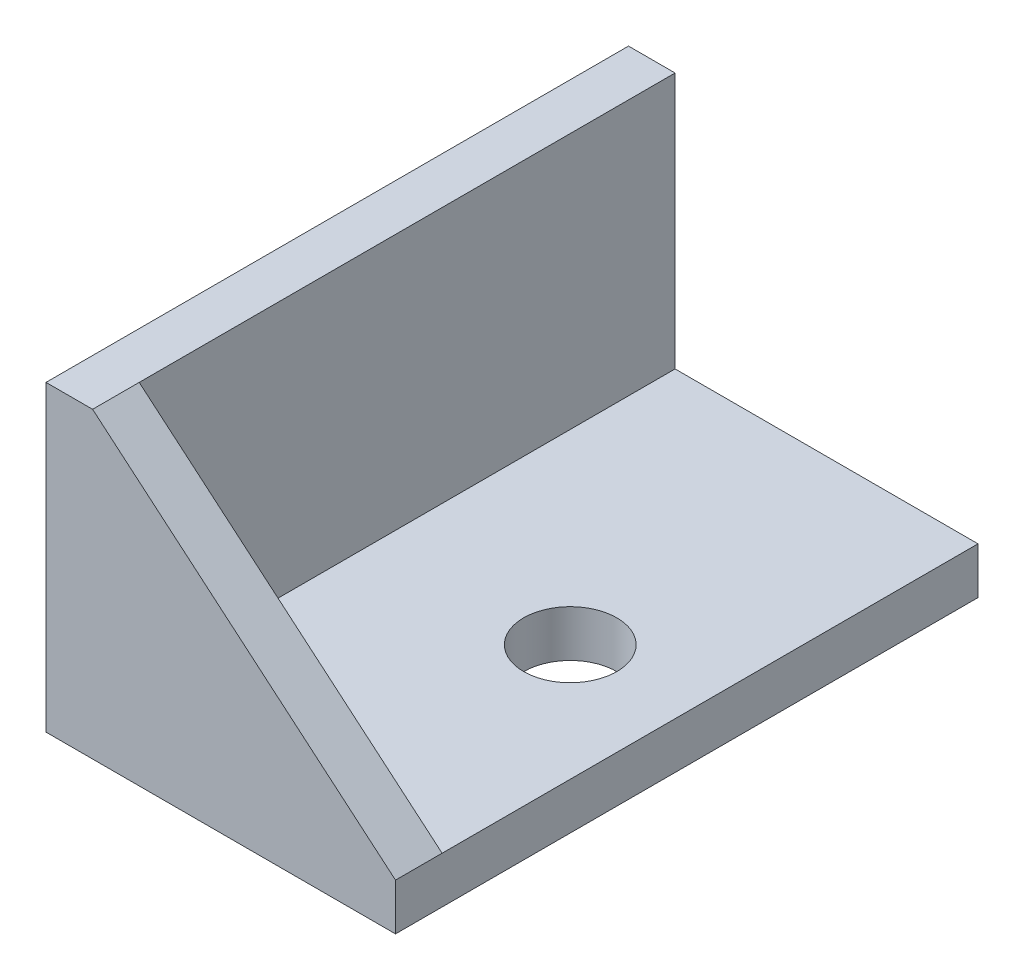
ISO-10303-21;
HEADER;
FILE_DESCRIPTION(('STEP AP214'),'2;1');
FILE_NAME('part.step','',(''),(''),'','','');
FILE_SCHEMA(('AUTOMOTIVE_DESIGN { 1 0 10303 214 1 1 1 1 }'));
ENDSEC;
DATA;
#1=APPLICATION_CONTEXT('core data for automotive mechanical design processes');
#2=APPLICATION_PROTOCOL_DEFINITION('international standard','automotive_design',2000,#1);
#3=PRODUCT_CONTEXT('',#1,'mechanical');
#4=PRODUCT('Part','Part','',(#3));
#5=PRODUCT_RELATED_PRODUCT_CATEGORY('part','',(#4));
#6=PRODUCT_DEFINITION_FORMATION('','',#4);
#7=PRODUCT_DEFINITION_CONTEXT('part definition',#1,'design');
#8=PRODUCT_DEFINITION('design','',#6,#7);
#9=PRODUCT_DEFINITION_SHAPE('','',#8);
#10=(LENGTH_UNIT() NAMED_UNIT(*) SI_UNIT(.MILLI.,.METRE.));
#11=(NAMED_UNIT(*) PLANE_ANGLE_UNIT() SI_UNIT($,.RADIAN.));
#12=(NAMED_UNIT(*) SI_UNIT($,.STERADIAN.) SOLID_ANGLE_UNIT());
#13=UNCERTAINTY_MEASURE_WITH_UNIT(LENGTH_MEASURE(1.E-05),#10,'distance_accuracy_value','');
#14=(GEOMETRIC_REPRESENTATION_CONTEXT(3) GLOBAL_UNCERTAINTY_ASSIGNED_CONTEXT((#13)) GLOBAL_UNIT_ASSIGNED_CONTEXT((#10,
#11,#12)) REPRESENTATION_CONTEXT('',''));
#15=CARTESIAN_POINT('',(0.,0.,0.));
#16=DIRECTION('',(0.,0.,1.));
#17=DIRECTION('',(1.,0.,0.));
#18=AXIS2_PLACEMENT_3D('',#15,#16,#17);
#19=CARTESIAN_POINT('',(9.99999999999999,65.,-125.));
#20=DIRECTION('',(1.,0.,0.));
#21=DIRECTION('',(0.,1.,0.));
#22=AXIS2_PLACEMENT_3D('',#19,#20,#21);
#23=PLANE('',#22);
#24=DIRECTION('',(0.,0.,1.));
#25=VECTOR('',#24,1.);
#26=CARTESIAN_POINT('',(9.99999999999999,65.,-125.));
#27=LINE('',#26,#25);
#28=CARTESIAN_POINT('',(9.99999999999999,65.,-125.));
#29=VERTEX_POINT('',#28);
#30=CARTESIAN_POINT('',(9.99999999999999,65.,-10.));
#31=VERTEX_POINT('',#30);
#32=EDGE_CURVE('E99',#29,#31,#27,.T.);
#33=ORIENTED_EDGE('',*,*,#32,.T.);
#34=DIRECTION('',(0.,-1.,0.));
#35=VECTOR('',#34,1.);
#36=CARTESIAN_POINT('',(10.,10.,-10.));
#37=LINE('',#36,#35);
#38=CARTESIAN_POINT('',(10.,10.,-10.));
#39=VERTEX_POINT('',#38);
#40=EDGE_CURVE('E217',#31,#39,#37,.T.);
#41=ORIENTED_EDGE('',*,*,#40,.T.);
#42=DIRECTION('',(0.,0.,1.));
#43=VECTOR('',#42,1.);
#44=CARTESIAN_POINT('',(10.,10.,-125.));
#45=LINE('',#44,#43);
#46=CARTESIAN_POINT('',(10.,10.,-125.));
#47=VERTEX_POINT('',#46);
#48=EDGE_CURVE('E110',#47,#39,#45,.T.);
#49=ORIENTED_EDGE('',*,*,#48,.F.);
#50=DIRECTION('',(0.,1.,0.));
#51=VECTOR('',#50,1.);
#52=CARTESIAN_POINT('',(9.99999999999999,65.,-125.));
#53=LINE('',#52,#51);
#54=EDGE_CURVE('E116',#47,#29,#53,.T.);
#55=ORIENTED_EDGE('',*,*,#54,.T.);
#56=EDGE_LOOP('',(#33,#41,#49,#55));
#57=FACE_BOUND('',#56,.T.);
#58=ADVANCED_FACE('F43',(#57),#23,.T.);
#59=CARTESIAN_POINT('',(10.,10.,-125.));
#60=DIRECTION('',(0.,1.,0.));
#61=DIRECTION('',(-1.,0.,0.));
#62=AXIS2_PLACEMENT_3D('',#59,#60,#61);
#63=PLANE('',#62);
#64=CARTESIAN_POINT('',(50.,10.,-62.5));
#65=DIRECTION('',(0.,1.,0.));
#66=DIRECTION('',(-1.,0.,0.));
#67=AXIS2_PLACEMENT_3D('',#64,#65,#66);
#68=CIRCLE('',#67,10.);
#69=CARTESIAN_POINT('',(40.,10.,-62.5));
#70=VERTEX_POINT('',#69);
#71=EDGE_CURVE('E210',#70,#70,#68,.T.);
#72=ORIENTED_EDGE('',*,*,#71,.F.);
#73=EDGE_LOOP('',(#72));
#74=FACE_BOUND('',#73,.T.);
#75=ORIENTED_EDGE('',*,*,#48,.T.);
#76=DIRECTION('',(1.,0.,0.));
#77=VECTOR('',#76,1.);
#78=CARTESIAN_POINT('',(75.,10.,-10.));
#79=LINE('',#78,#77);
#80=CARTESIAN_POINT('',(75.,10.,-10.));
#81=VERTEX_POINT('',#80);
#82=EDGE_CURVE('E220',#39,#81,#79,.T.);
#83=ORIENTED_EDGE('',*,*,#82,.T.);
#84=DIRECTION('',(0.,0.,1.));
#85=VECTOR('',#84,1.);
#86=CARTESIAN_POINT('',(75.,10.,-125.));
#87=LINE('',#86,#85);
#88=CARTESIAN_POINT('',(75.,10.,-125.));
#89=VERTEX_POINT('',#88);
#90=EDGE_CURVE('E151',#89,#81,#87,.T.);
#91=ORIENTED_EDGE('',*,*,#90,.F.);
#92=DIRECTION('',(-1.,0.,0.));
#93=VECTOR('',#92,1.);
#94=CARTESIAN_POINT('',(10.,10.,-125.));
#95=LINE('',#94,#93);
#96=EDGE_CURVE('E123',#89,#47,#95,.T.);
#97=ORIENTED_EDGE('',*,*,#96,.T.);
#98=EDGE_LOOP('',(#75,#83,#91,#97));
#99=FACE_BOUND('',#98,.T.);
#100=ADVANCED_FACE('F172',(#74,#99),#63,.T.);
#101=CARTESIAN_POINT('',(75.,0.,-125.));
#102=DIRECTION('',(0.,-1.,0.));
#103=DIRECTION('',(1.,0.,0.));
#104=AXIS2_PLACEMENT_3D('',#101,#102,#103);
#105=PLANE('',#104);
#106=CARTESIAN_POINT('',(50.,0.,-62.5));
#107=DIRECTION('',(0.,1.,0.));
#108=DIRECTION('',(-1.,0.,0.));
#109=AXIS2_PLACEMENT_3D('',#106,#107,#108);
#110=CIRCLE('',#109,10.);
#111=CARTESIAN_POINT('',(40.,0.,-62.5));
#112=VERTEX_POINT('',#111);
#113=EDGE_CURVE('E207',#112,#112,#110,.T.);
#114=ORIENTED_EDGE('',*,*,#113,.T.);
#115=EDGE_LOOP('',(#114));
#116=FACE_BOUND('',#115,.T.);
#117=DIRECTION('',(1.,0.,0.));
#118=VECTOR('',#117,1.);
#119=CARTESIAN_POINT('',(75.,0.,0.));
#120=LINE('',#119,#118);
#121=CARTESIAN_POINT('',(0.,0.,0.));
#122=VERTEX_POINT('',#121);
#123=CARTESIAN_POINT('',(75.,0.,0.));
#124=VERTEX_POINT('',#123);
#125=EDGE_CURVE('E132',#122,#124,#120,.T.);
#126=ORIENTED_EDGE('',*,*,#125,.F.);
#127=DIRECTION('',(0.,0.,1.));
#128=VECTOR('',#127,1.);
#129=CARTESIAN_POINT('',(0.,0.,-125.));
#130=LINE('',#129,#128);
#131=CARTESIAN_POINT('',(0.,0.,-125.));
#132=VERTEX_POINT('',#131);
#133=EDGE_CURVE('E11',#132,#122,#130,.T.);
#134=ORIENTED_EDGE('',*,*,#133,.F.);
#135=DIRECTION('',(1.,0.,0.));
#136=VECTOR('',#135,1.);
#137=CARTESIAN_POINT('',(75.,0.,-125.));
#138=LINE('',#137,#136);
#139=CARTESIAN_POINT('',(75.,0.,-125.));
#140=VERTEX_POINT('',#139);
#141=EDGE_CURVE('E146',#132,#140,#138,.T.);
#142=ORIENTED_EDGE('',*,*,#141,.T.);
#143=DIRECTION('',(0.,0.,1.));
#144=VECTOR('',#143,1.);
#145=CARTESIAN_POINT('',(75.,0.,-125.));
#146=LINE('',#145,#144);
#147=EDGE_CURVE('E47',#140,#124,#146,.T.);
#148=ORIENTED_EDGE('',*,*,#147,.T.);
#149=EDGE_LOOP('',(#126,#134,#142,#148));
#150=FACE_BOUND('',#149,.T.);
#151=ADVANCED_FACE('F45',(#116,#150),#105,.T.);
#152=CARTESIAN_POINT('',(0.,0.,-125.));
#153=DIRECTION('',(-1.,0.,0.));
#154=DIRECTION('',(0.,0.,1.));
#155=AXIS2_PLACEMENT_3D('',#152,#153,#154);
#156=PLANE('',#155);
#157=DIRECTION('',(0.,-1.,0.));
#158=VECTOR('',#157,1.);
#159=CARTESIAN_POINT('',(0.,0.,0.));
#160=LINE('',#159,#158);
#161=CARTESIAN_POINT('',(0.,65.,0.));
#162=VERTEX_POINT('',#161);
#163=EDGE_CURVE('E143',#162,#122,#160,.T.);
#164=ORIENTED_EDGE('',*,*,#163,.F.);
#165=DIRECTION('',(0.,0.,1.));
#166=VECTOR('',#165,1.);
#167=CARTESIAN_POINT('',(0.,65.,-125.));
#168=LINE('',#167,#166);
#169=CARTESIAN_POINT('',(0.,65.,-125.));
#170=VERTEX_POINT('',#169);
#171=EDGE_CURVE('E54',#170,#162,#168,.T.);
#172=ORIENTED_EDGE('',*,*,#171,.F.);
#173=DIRECTION('',(0.,-1.,0.));
#174=VECTOR('',#173,1.);
#175=CARTESIAN_POINT('',(0.,0.,-125.));
#176=LINE('',#175,#174);
#177=EDGE_CURVE('E118',#170,#132,#176,.T.);
#178=ORIENTED_EDGE('',*,*,#177,.T.);
#179=ORIENTED_EDGE('',*,*,#133,.T.);
#180=EDGE_LOOP('',(#164,#172,#178,#179));
#181=FACE_BOUND('',#180,.T.);
#182=ADVANCED_FACE('F164',(#181),#156,.T.);
#183=CARTESIAN_POINT('',(0.,65.,-125.));
#184=DIRECTION('',(0.,1.,0.));
#185=DIRECTION('',(-1.,0.,0.));
#186=AXIS2_PLACEMENT_3D('',#183,#184,#185);
#187=PLANE('',#186);
#188=DIRECTION('',(-1.,0.,0.));
#189=VECTOR('',#188,1.);
#190=CARTESIAN_POINT('',(0.,65.,0.));
#191=LINE('',#190,#189);
#192=CARTESIAN_POINT('',(9.99999999999999,65.,0.));
#193=VERTEX_POINT('',#192);
#194=EDGE_CURVE('E140',#193,#162,#191,.T.);
#195=ORIENTED_EDGE('',*,*,#194,.F.);
#196=DIRECTION('',(0.,0.,1.));
#197=VECTOR('',#196,1.);
#198=CARTESIAN_POINT('',(9.99999999999999,65.,-10.));
#199=LINE('',#198,#197);
#200=EDGE_CURVE('E105',#31,#193,#199,.T.);
#201=ORIENTED_EDGE('',*,*,#200,.F.);
#202=ORIENTED_EDGE('',*,*,#32,.F.);
#203=DIRECTION('',(-1.,0.,0.));
#204=VECTOR('',#203,1.);
#205=CARTESIAN_POINT('',(0.,65.,-125.));
#206=LINE('',#205,#204);
#207=EDGE_CURVE('E102',#29,#170,#206,.T.);
#208=ORIENTED_EDGE('',*,*,#207,.T.);
#209=ORIENTED_EDGE('',*,*,#171,.T.);
#210=EDGE_LOOP('',(#195,#201,#202,#208,#209));
#211=FACE_BOUND('',#210,.T.);
#212=ADVANCED_FACE('F101',(#211),#187,.T.);
#213=CARTESIAN_POINT('',(75.,10.,-125.));
#214=DIRECTION('',(1.,0.,0.));
#215=DIRECTION('',(0.,0.,-1.));
#216=AXIS2_PLACEMENT_3D('',#213,#214,#215);
#217=PLANE('',#216);
#218=DIRECTION('',(0.,1.,0.));
#219=VECTOR('',#218,1.);
#220=CARTESIAN_POINT('',(75.,10.,0.));
#221=LINE('',#220,#219);
#222=CARTESIAN_POINT('',(75.,10.,0.));
#223=VERTEX_POINT('',#222);
#224=EDGE_CURVE('E136',#124,#223,#221,.T.);
#225=ORIENTED_EDGE('',*,*,#224,.F.);
#226=ORIENTED_EDGE('',*,*,#147,.F.);
#227=DIRECTION('',(0.,1.,0.));
#228=VECTOR('',#227,1.);
#229=CARTESIAN_POINT('',(75.,10.,-125.));
#230=LINE('',#229,#228);
#231=EDGE_CURVE('E126',#140,#89,#230,.T.);
#232=ORIENTED_EDGE('',*,*,#231,.T.);
#233=ORIENTED_EDGE('',*,*,#90,.T.);
#234=DIRECTION('',(0.,0.,1.));
#235=VECTOR('',#234,1.);
#236=CARTESIAN_POINT('',(75.,10.,-10.));
#237=LINE('',#236,#235);
#238=EDGE_CURVE('E160',#81,#223,#237,.T.);
#239=ORIENTED_EDGE('',*,*,#238,.T.);
#240=EDGE_LOOP('',(#225,#226,#232,#233,#239));
#241=FACE_BOUND('',#240,.T.);
#242=ADVANCED_FACE('F157',(#241),#217,.T.);
#243=CARTESIAN_POINT('',(0.,0.,-125.));
#244=DIRECTION('',(0.,0.,-1.));
#245=DIRECTION('',(-1.,0.,0.));
#246=AXIS2_PLACEMENT_3D('',#243,#244,#245);
#247=PLANE('',#246);
#248=ORIENTED_EDGE('',*,*,#141,.F.);
#249=ORIENTED_EDGE('',*,*,#177,.F.);
#250=ORIENTED_EDGE('',*,*,#207,.F.);
#251=ORIENTED_EDGE('',*,*,#54,.F.);
#252=ORIENTED_EDGE('',*,*,#96,.F.);
#253=ORIENTED_EDGE('',*,*,#231,.F.);
#254=EDGE_LOOP('',(#248,#249,#250,#251,#252,#253));
#255=FACE_BOUND('',#254,.T.);
#256=ADVANCED_FACE('F114',(#255),#247,.T.);
#257=CARTESIAN_POINT('',(0.,0.,0.));
#258=DIRECTION('',(0.,0.,-1.));
#259=DIRECTION('',(-1.,0.,0.));
#260=AXIS2_PLACEMENT_3D('',#257,#258,#259);
#261=PLANE('',#260);
#262=DIRECTION('',(-0.763386285369114,0.645942241466174,0.));
#263=VECTOR('',#262,1.);
#264=CARTESIAN_POINT('',(9.99999999999999,65.,0.));
#265=LINE('',#264,#263);
#266=EDGE_CURVE('E214',#223,#193,#265,.T.);
#267=ORIENTED_EDGE('',*,*,#266,.T.);
#268=ORIENTED_EDGE('',*,*,#194,.T.);
#269=ORIENTED_EDGE('',*,*,#163,.T.);
#270=ORIENTED_EDGE('',*,*,#125,.T.);
#271=ORIENTED_EDGE('',*,*,#224,.T.);
#272=EDGE_LOOP('',(#267,#268,#269,#270,#271));
#273=FACE_BOUND('',#272,.T.);
#274=ADVANCED_FACE('F163',(#273),#261,.F.);
#275=CARTESIAN_POINT('',(9.99999999999999,65.,-10.));
#276=DIRECTION('',(0.645942241466174,0.763386285369115,0.));
#277=DIRECTION('',(-0.763386285369115,0.645942241466174,0.));
#278=AXIS2_PLACEMENT_3D('',#275,#276,#277);
#279=PLANE('',#278);
#280=ORIENTED_EDGE('',*,*,#266,.F.);
#281=ORIENTED_EDGE('',*,*,#238,.F.);
#282=DIRECTION('',(-0.763386285369114,0.645942241466174,0.));
#283=VECTOR('',#282,1.);
#284=CARTESIAN_POINT('',(9.99999999999999,65.,-10.));
#285=LINE('',#284,#283);
#286=EDGE_CURVE('E224',#81,#31,#285,.T.);
#287=ORIENTED_EDGE('',*,*,#286,.T.);
#288=ORIENTED_EDGE('',*,*,#200,.T.);
#289=EDGE_LOOP('',(#280,#281,#287,#288));
#290=FACE_BOUND('',#289,.T.);
#291=ADVANCED_FACE('F190',(#290),#279,.T.);
#292=CARTESIAN_POINT('',(0.,0.,-10.));
#293=DIRECTION('',(0.,0.,1.));
#294=DIRECTION('',(1.,0.,0.));
#295=AXIS2_PLACEMENT_3D('',#292,#293,#294);
#296=PLANE('',#295);
#297=ORIENTED_EDGE('',*,*,#40,.F.);
#298=ORIENTED_EDGE('',*,*,#286,.F.);
#299=ORIENTED_EDGE('',*,*,#82,.F.);
#300=EDGE_LOOP('',(#297,#298,#299));
#301=FACE_BOUND('',#300,.T.);
#302=ADVANCED_FACE('F194',(#301),#296,.F.);
#303=CARTESIAN_POINT('',(50.,0.,-62.5));
#304=DIRECTION('',(0.,1.,0.));
#305=DIRECTION('',(-1.,0.,0.));
#306=AXIS2_PLACEMENT_3D('',#303,#304,#305);
#307=CYLINDRICAL_SURFACE('',#306,10.);
#308=ORIENTED_EDGE('',*,*,#113,.F.);
#309=EDGE_LOOP('',(#308));
#310=FACE_BOUND('',#309,.T.);
#311=ORIENTED_EDGE('',*,*,#71,.T.);
#312=EDGE_LOOP('',(#311));
#313=FACE_BOUND('',#312,.T.);
#314=ADVANCED_FACE('F198',(#310,#313),#307,.F.);
#315=CLOSED_SHELL('',(#58,#100,#151,#182,#212,#242,#256,#274,#291,#302,#314));
#316=MANIFOLD_SOLID_BREP('B2',#315);
#317=ADVANCED_BREP_SHAPE_REPRESENTATION('',(#18,#316),#14);
#318=SHAPE_DEFINITION_REPRESENTATION(#9,#317);
ENDSEC;
END-ISO-10303-21;
